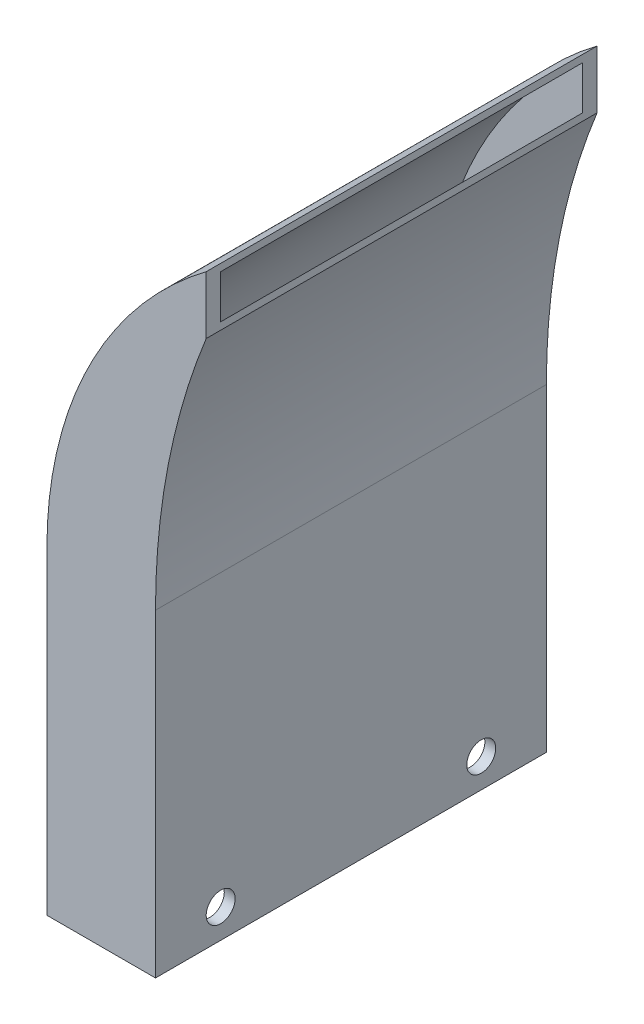
ISO-10303-21;
HEADER;
FILE_DESCRIPTION(('STEP AP214'),'2;1');
FILE_NAME('part.step','',(''),(''),'','','');
FILE_SCHEMA(('AUTOMOTIVE_DESIGN { 1 0 10303 214 1 1 1 1 }'));
ENDSEC;
DATA;
#1=APPLICATION_CONTEXT('core data for automotive mechanical design processes');
#2=APPLICATION_PROTOCOL_DEFINITION('international standard','automotive_design',2000,#1);
#3=PRODUCT_CONTEXT('',#1,'mechanical');
#4=PRODUCT('Part','Part','',(#3));
#5=PRODUCT_RELATED_PRODUCT_CATEGORY('part','',(#4));
#6=PRODUCT_DEFINITION_FORMATION('','',#4);
#7=PRODUCT_DEFINITION_CONTEXT('part definition',#1,'design');
#8=PRODUCT_DEFINITION('design','',#6,#7);
#9=PRODUCT_DEFINITION_SHAPE('','',#8);
#10=(LENGTH_UNIT() NAMED_UNIT(*) SI_UNIT(.MILLI.,.METRE.));
#11=(NAMED_UNIT(*) PLANE_ANGLE_UNIT() SI_UNIT($,.RADIAN.));
#12=(NAMED_UNIT(*) SI_UNIT($,.STERADIAN.) SOLID_ANGLE_UNIT());
#13=UNCERTAINTY_MEASURE_WITH_UNIT(LENGTH_MEASURE(1.E-05),#10,'distance_accuracy_value','');
#14=(GEOMETRIC_REPRESENTATION_CONTEXT(3) GLOBAL_UNCERTAINTY_ASSIGNED_CONTEXT((#13)) GLOBAL_UNIT_ASSIGNED_CONTEXT((#10,
#11,#12)) REPRESENTATION_CONTEXT('',''));
#15=CARTESIAN_POINT('',(0.,0.,0.));
#16=DIRECTION('',(0.,0.,1.));
#17=DIRECTION('',(1.,0.,0.));
#18=AXIS2_PLACEMENT_3D('',#15,#16,#17);
#19=CARTESIAN_POINT('',(-10.25,0.,27.));
#20=DIRECTION('',(-1.,0.,0.));
#21=DIRECTION('',(0.,0.,1.));
#22=AXIS2_PLACEMENT_3D('',#19,#20,#21);
#23=PLANE('',#22);
#24=CARTESIAN_POINT('',(-10.25,2.,4.5));
#25=DIRECTION('',(-1.,0.,0.));
#26=DIRECTION('',(0.,0.,1.));
#27=AXIS2_PLACEMENT_3D('',#24,#25,#26);
#28=CIRCLE('',#27,1.);
#29=CARTESIAN_POINT('',(-10.25,2.,5.5));
#30=VERTEX_POINT('',#29);
#31=EDGE_CURVE('E219',#30,#30,#28,.T.);
#32=ORIENTED_EDGE('',*,*,#31,.T.);
#33=EDGE_LOOP('',(#32));
#34=FACE_BOUND('',#33,.T.);
#35=CARTESIAN_POINT('',(-10.25,2.,22.5));
#36=DIRECTION('',(-1.,0.,0.));
#37=DIRECTION('',(0.,0.,1.));
#38=AXIS2_PLACEMENT_3D('',#35,#36,#37);
#39=CIRCLE('',#38,1.);
#40=CARTESIAN_POINT('',(-10.25,2.,23.5));
#41=VERTEX_POINT('',#40);
#42=EDGE_CURVE('E204',#41,#41,#39,.T.);
#43=ORIENTED_EDGE('',*,*,#42,.T.);
#44=EDGE_LOOP('',(#43));
#45=FACE_BOUND('',#44,.T.);
#46=DIRECTION('',(0.,1.,0.));
#47=VECTOR('',#46,1.);
#48=CARTESIAN_POINT('',(-10.25,0.,1.));
#49=LINE('',#48,#47);
#50=CARTESIAN_POINT('',(-10.25,0.,1.));
#51=VERTEX_POINT('',#50);
#52=CARTESIAN_POINT('',(-10.25,22.,1.));
#53=VERTEX_POINT('',#52);
#54=EDGE_CURVE('E55',#51,#53,#49,.T.);
#55=ORIENTED_EDGE('',*,*,#54,.T.);
#56=DIRECTION('',(0.,0.,-1.));
#57=VECTOR('',#56,1.);
#58=CARTESIAN_POINT('',(-10.25,22.,27.));
#59=LINE('',#58,#57);
#60=CARTESIAN_POINT('',(-10.25,22.,26.));
#61=VERTEX_POINT('',#60);
#62=EDGE_CURVE('E45',#61,#53,#59,.T.);
#63=ORIENTED_EDGE('',*,*,#62,.F.);
#64=DIRECTION('',(0.,-1.,0.));
#65=VECTOR('',#64,1.);
#66=CARTESIAN_POINT('',(-10.25,0.,26.));
#67=LINE('',#66,#65);
#68=CARTESIAN_POINT('',(-10.25,0.,26.));
#69=VERTEX_POINT('',#68);
#70=EDGE_CURVE('E170',#61,#69,#67,.T.);
#71=ORIENTED_EDGE('',*,*,#70,.T.);
#72=DIRECTION('',(0.,0.,-1.));
#73=VECTOR('',#72,1.);
#74=CARTESIAN_POINT('',(-10.25,0.,27.));
#75=LINE('',#74,#73);
#76=EDGE_CURVE('E11',#69,#51,#75,.T.);
#77=ORIENTED_EDGE('',*,*,#76,.T.);
#78=EDGE_LOOP('',(#55,#63,#71,#77));
#79=FACE_BOUND('',#78,.T.);
#80=ADVANCED_FACE('F36',(#34,#45,#79),#23,.F.);
#81=CARTESIAN_POINT('',(17.4237804878049,22.,27.));
#82=DIRECTION('',(0.,0.,-1.));
#83=DIRECTION('',(-1.,0.,0.));
#84=AXIS2_PLACEMENT_3D('',#81,#82,#83);
#85=CYLINDRICAL_SURFACE('',#84,27.6737804878049);
#86=CARTESIAN_POINT('',(17.4237804878049,22.,1.));
#87=DIRECTION('',(0.,0.,-1.));
#88=DIRECTION('',(-1.,0.,0.));
#89=AXIS2_PLACEMENT_3D('',#86,#87,#88);
#90=CIRCLE('',#89,27.6737804878049);
#91=CARTESIAN_POINT('',(0.,43.5,1.));
#92=VERTEX_POINT('',#91);
#93=EDGE_CURVE('E228',#53,#92,#90,.T.);
#94=ORIENTED_EDGE('',*,*,#93,.T.);
#95=DIRECTION('',(0.,0.,-1.));
#96=VECTOR('',#95,1.);
#97=CARTESIAN_POINT('',(0.,43.5,27.));
#98=LINE('',#97,#96);
#99=CARTESIAN_POINT('',(0.,43.5,26.));
#100=VERTEX_POINT('',#99);
#101=EDGE_CURVE('E194',#100,#92,#98,.T.);
#102=ORIENTED_EDGE('',*,*,#101,.F.);
#103=CARTESIAN_POINT('',(17.4237804878049,22.,26.));
#104=DIRECTION('',(0.,0.,1.));
#105=DIRECTION('',(-1.,0.,0.));
#106=AXIS2_PLACEMENT_3D('',#103,#104,#105);
#107=CIRCLE('',#106,27.6737804878049);
#108=EDGE_CURVE('E167',#100,#61,#107,.T.);
#109=ORIENTED_EDGE('',*,*,#108,.T.);
#110=ORIENTED_EDGE('',*,*,#62,.T.);
#111=EDGE_LOOP('',(#94,#102,#109,#110));
#112=FACE_BOUND('',#111,.T.);
#113=ADVANCED_FACE('F262',(#112),#85,.F.);
#114=CARTESIAN_POINT('',(38.1397058823529,22.,27.));
#115=DIRECTION('',(0.,0.,-1.));
#116=DIRECTION('',(-1.,0.,0.));
#117=AXIS2_PLACEMENT_3D('',#114,#115,#116);
#118=CYLINDRICAL_SURFACE('',#117,42.3897058823529);
#119=CARTESIAN_POINT('',(38.1397058823529,22.,1.));
#120=DIRECTION('',(0.,0.,1.));
#121=DIRECTION('',(-1.,0.,0.));
#122=AXIS2_PLACEMENT_3D('',#119,#120,#121);
#123=CIRCLE('',#122,42.3897058823529);
#124=CARTESIAN_POINT('',(0.,40.5,1.));
#125=VERTEX_POINT('',#124);
#126=CARTESIAN_POINT('',(-4.25,22.,1.));
#127=VERTEX_POINT('',#126);
#128=EDGE_CURVE('E233',#125,#127,#123,.T.);
#129=ORIENTED_EDGE('',*,*,#128,.T.);
#130=DIRECTION('',(0.,0.,-1.));
#131=VECTOR('',#130,1.);
#132=CARTESIAN_POINT('',(-4.25,22.,27.));
#133=LINE('',#132,#131);
#134=CARTESIAN_POINT('',(-4.25,22.,26.));
#135=VERTEX_POINT('',#134);
#136=EDGE_CURVE('E158',#135,#127,#133,.T.);
#137=ORIENTED_EDGE('',*,*,#136,.F.);
#138=CARTESIAN_POINT('',(38.1397058823529,22.,26.));
#139=DIRECTION('',(0.,0.,-1.));
#140=DIRECTION('',(-1.,0.,0.));
#141=AXIS2_PLACEMENT_3D('',#138,#139,#140);
#142=CIRCLE('',#141,42.3897058823529);
#143=CARTESIAN_POINT('',(0.,40.5,26.));
#144=VERTEX_POINT('',#143);
#145=EDGE_CURVE('E156',#135,#144,#142,.T.);
#146=ORIENTED_EDGE('',*,*,#145,.T.);
#147=DIRECTION('',(0.,0.,-1.));
#148=VECTOR('',#147,1.);
#149=CARTESIAN_POINT('',(0.,40.5,27.));
#150=LINE('',#149,#148);
#151=EDGE_CURVE('E153',#144,#125,#150,.T.);
#152=ORIENTED_EDGE('',*,*,#151,.T.);
#153=EDGE_LOOP('',(#129,#137,#146,#152));
#154=FACE_BOUND('',#153,.T.);
#155=ADVANCED_FACE('F265',(#154),#118,.T.);
#156=CARTESIAN_POINT('',(-4.25,0.,27.));
#157=DIRECTION('',(1.,0.,0.));
#158=DIRECTION('',(0.,0.,-1.));
#159=AXIS2_PLACEMENT_3D('',#156,#157,#158);
#160=PLANE('',#159);
#161=CARTESIAN_POINT('',(-4.25,2.,4.5));
#162=DIRECTION('',(1.,0.,0.));
#163=DIRECTION('',(0.,0.,-1.));
#164=AXIS2_PLACEMENT_3D('',#161,#162,#163);
#165=CIRCLE('',#164,1.);
#166=CARTESIAN_POINT('',(-4.25,2.,3.5));
#167=VERTEX_POINT('',#166);
#168=EDGE_CURVE('E216',#167,#167,#165,.T.);
#169=ORIENTED_EDGE('',*,*,#168,.T.);
#170=EDGE_LOOP('',(#169));
#171=FACE_BOUND('',#170,.T.);
#172=CARTESIAN_POINT('',(-4.25,2.,22.5));
#173=DIRECTION('',(1.,0.,0.));
#174=DIRECTION('',(0.,0.,-1.));
#175=AXIS2_PLACEMENT_3D('',#172,#173,#174);
#176=CIRCLE('',#175,1.);
#177=CARTESIAN_POINT('',(-4.25,2.,21.5));
#178=VERTEX_POINT('',#177);
#179=EDGE_CURVE('E199',#178,#178,#176,.T.);
#180=ORIENTED_EDGE('',*,*,#179,.T.);
#181=EDGE_LOOP('',(#180));
#182=FACE_BOUND('',#181,.T.);
#183=DIRECTION('',(0.,-1.,0.));
#184=VECTOR('',#183,1.);
#185=CARTESIAN_POINT('',(-4.25,0.,1.));
#186=LINE('',#185,#184);
#187=CARTESIAN_POINT('',(-4.25,0.,1.));
#188=VERTEX_POINT('',#187);
#189=EDGE_CURVE('E222',#127,#188,#186,.T.);
#190=ORIENTED_EDGE('',*,*,#189,.T.);
#191=DIRECTION('',(0.,0.,-1.));
#192=VECTOR('',#191,1.);
#193=CARTESIAN_POINT('',(-4.25,0.,27.));
#194=LINE('',#193,#192);
#195=CARTESIAN_POINT('',(-4.25,0.,26.));
#196=VERTEX_POINT('',#195);
#197=EDGE_CURVE('E243',#196,#188,#194,.T.);
#198=ORIENTED_EDGE('',*,*,#197,.F.);
#199=DIRECTION('',(0.,1.,0.));
#200=VECTOR('',#199,1.);
#201=CARTESIAN_POINT('',(-4.25,0.,26.));
#202=LINE('',#201,#200);
#203=EDGE_CURVE('E152',#196,#135,#202,.T.);
#204=ORIENTED_EDGE('',*,*,#203,.T.);
#205=ORIENTED_EDGE('',*,*,#136,.T.);
#206=EDGE_LOOP('',(#190,#198,#204,#205));
#207=FACE_BOUND('',#206,.T.);
#208=ADVANCED_FACE('F249',(#171,#182,#207),#160,.F.);
#209=CARTESIAN_POINT('',(-11.,0.,27.));
#210=DIRECTION('',(0.,1.,0.));
#211=DIRECTION('',(-1.,0.,0.));
#212=AXIS2_PLACEMENT_3D('',#209,#210,#211);
#213=PLANE('',#212);
#214=DIRECTION('',(1.,0.,0.));
#215=VECTOR('',#214,1.);
#216=CARTESIAN_POINT('',(-11.,0.,0.));
#217=LINE('',#216,#215);
#218=CARTESIAN_POINT('',(-11.,0.,0.));
#219=VERTEX_POINT('',#218);
#220=CARTESIAN_POINT('',(-3.5,0.,0.));
#221=VERTEX_POINT('',#220);
#222=EDGE_CURVE('E175',#219,#221,#217,.T.);
#223=ORIENTED_EDGE('',*,*,#222,.T.);
#224=DIRECTION('',(0.,0.,-1.));
#225=VECTOR('',#224,1.);
#226=CARTESIAN_POINT('',(-3.5,0.,27.));
#227=LINE('',#226,#225);
#228=CARTESIAN_POINT('',(-3.5,0.,27.));
#229=VERTEX_POINT('',#228);
#230=EDGE_CURVE('E240',#229,#221,#227,.T.);
#231=ORIENTED_EDGE('',*,*,#230,.F.);
#232=DIRECTION('',(1.,0.,0.));
#233=VECTOR('',#232,1.);
#234=CARTESIAN_POINT('',(-11.,0.,27.));
#235=LINE('',#234,#233);
#236=CARTESIAN_POINT('',(-11.,0.,27.));
#237=VERTEX_POINT('',#236);
#238=EDGE_CURVE('E137',#237,#229,#235,.T.);
#239=ORIENTED_EDGE('',*,*,#238,.F.);
#240=DIRECTION('',(0.,0.,-1.));
#241=VECTOR('',#240,1.);
#242=CARTESIAN_POINT('',(-11.,0.,27.));
#243=LINE('',#242,#241);
#244=EDGE_CURVE('E181',#237,#219,#243,.T.);
#245=ORIENTED_EDGE('',*,*,#244,.T.);
#246=EDGE_LOOP('',(#223,#231,#239,#245));
#247=FACE_BOUND('',#246,.T.);
#248=DIRECTION('',(-1.,0.,0.));
#249=VECTOR('',#248,1.);
#250=CARTESIAN_POINT('',(-4.25,0.,1.));
#251=LINE('',#250,#249);
#252=EDGE_CURVE('E224',#188,#51,#251,.T.);
#253=ORIENTED_EDGE('',*,*,#252,.T.);
#254=ORIENTED_EDGE('',*,*,#76,.F.);
#255=DIRECTION('',(1.,0.,0.));
#256=VECTOR('',#255,1.);
#257=CARTESIAN_POINT('',(-4.25,0.,26.));
#258=LINE('',#257,#256);
#259=EDGE_CURVE('E172',#69,#196,#258,.T.);
#260=ORIENTED_EDGE('',*,*,#259,.T.);
#261=ORIENTED_EDGE('',*,*,#197,.T.);
#262=EDGE_LOOP('',(#253,#254,#260,#261));
#263=FACE_BOUND('',#262,.T.);
#264=ADVANCED_FACE('F38',(#247,#263),#213,.F.);
#265=CARTESIAN_POINT('',(0.,44.,27.));
#266=DIRECTION('',(-1.,0.,0.));
#267=DIRECTION('',(0.,-1.,0.));
#268=AXIS2_PLACEMENT_3D('',#265,#266,#267);
#269=PLANE('',#268);
#270=DIRECTION('',(0.,0.,-1.));
#271=VECTOR('',#270,1.);
#272=CARTESIAN_POINT('',(0.,40.,27.));
#273=LINE('',#272,#271);
#274=CARTESIAN_POINT('',(0.,40.,27.));
#275=VERTEX_POINT('',#274);
#276=CARTESIAN_POINT('',(0.,40.,0.));
#277=VERTEX_POINT('',#276);
#278=EDGE_CURVE('E130',#275,#277,#273,.T.);
#279=ORIENTED_EDGE('',*,*,#278,.T.);
#280=DIRECTION('',(0.,1.,0.));
#281=VECTOR('',#280,1.);
#282=CARTESIAN_POINT('',(0.,44.,0.));
#283=LINE('',#282,#281);
#284=CARTESIAN_POINT('',(0.,44.,0.));
#285=VERTEX_POINT('',#284);
#286=EDGE_CURVE('E183',#277,#285,#283,.T.);
#287=ORIENTED_EDGE('',*,*,#286,.T.);
#288=DIRECTION('',(0.,0.,-1.));
#289=VECTOR('',#288,1.);
#290=CARTESIAN_POINT('',(0.,44.,27.));
#291=LINE('',#290,#289);
#292=CARTESIAN_POINT('',(0.,44.,27.));
#293=VERTEX_POINT('',#292);
#294=EDGE_CURVE('E133',#293,#285,#291,.T.);
#295=ORIENTED_EDGE('',*,*,#294,.F.);
#296=DIRECTION('',(0.,1.,0.));
#297=VECTOR('',#296,1.);
#298=CARTESIAN_POINT('',(0.,44.,27.));
#299=LINE('',#298,#297);
#300=EDGE_CURVE('E125',#275,#293,#299,.T.);
#301=ORIENTED_EDGE('',*,*,#300,.F.);
#302=EDGE_LOOP('',(#279,#287,#295,#301));
#303=FACE_BOUND('',#302,.T.);
#304=ORIENTED_EDGE('',*,*,#101,.T.);
#305=DIRECTION('',(0.,-1.,0.));
#306=VECTOR('',#305,1.);
#307=CARTESIAN_POINT('',(0.,43.5,1.));
#308=LINE('',#307,#306);
#309=EDGE_CURVE('E230',#92,#125,#308,.T.);
#310=ORIENTED_EDGE('',*,*,#309,.T.);
#311=ORIENTED_EDGE('',*,*,#151,.F.);
#312=DIRECTION('',(0.,1.,0.));
#313=VECTOR('',#312,1.);
#314=CARTESIAN_POINT('',(0.,43.5,26.));
#315=LINE('',#314,#313);
#316=EDGE_CURVE('E164',#144,#100,#315,.T.);
#317=ORIENTED_EDGE('',*,*,#316,.T.);
#318=EDGE_LOOP('',(#304,#310,#311,#317));
#319=FACE_BOUND('',#318,.T.);
#320=ADVANCED_FACE('F127',(#303,#319),#269,.F.);
#321=CARTESIAN_POINT('',(16.5,22.,27.));
#322=DIRECTION('',(0.,0.,-1.));
#323=DIRECTION('',(-1.,0.,0.));
#324=AXIS2_PLACEMENT_3D('',#321,#322,#323);
#325=CYLINDRICAL_SURFACE('',#324,27.5);
#326=CARTESIAN_POINT('',(16.5,22.,0.));
#327=DIRECTION('',(0.,0.,1.));
#328=DIRECTION('',(-1.,0.,0.));
#329=AXIS2_PLACEMENT_3D('',#326,#327,#328);
#330=CIRCLE('',#329,27.5);
#331=CARTESIAN_POINT('',(-11.,22.,0.));
#332=VERTEX_POINT('',#331);
#333=EDGE_CURVE('E185',#285,#332,#330,.T.);
#334=ORIENTED_EDGE('',*,*,#333,.T.);
#335=DIRECTION('',(0.,0.,-1.));
#336=VECTOR('',#335,1.);
#337=CARTESIAN_POINT('',(-11.,22.,27.));
#338=LINE('',#337,#336);
#339=CARTESIAN_POINT('',(-11.,22.,27.));
#340=VERTEX_POINT('',#339);
#341=EDGE_CURVE('E190',#340,#332,#338,.T.);
#342=ORIENTED_EDGE('',*,*,#341,.F.);
#343=CARTESIAN_POINT('',(16.5,22.,27.));
#344=DIRECTION('',(0.,0.,1.));
#345=DIRECTION('',(-1.,0.,0.));
#346=AXIS2_PLACEMENT_3D('',#343,#344,#345);
#347=CIRCLE('',#346,27.5);
#348=EDGE_CURVE('E136',#293,#340,#347,.T.);
#349=ORIENTED_EDGE('',*,*,#348,.F.);
#350=ORIENTED_EDGE('',*,*,#294,.T.);
#351=EDGE_LOOP('',(#334,#342,#349,#350));
#352=FACE_BOUND('',#351,.T.);
#353=ADVANCED_FACE('F284',(#352),#325,.T.);
#354=CARTESIAN_POINT('',(-11.,0.,27.));
#355=DIRECTION('',(1.,0.,0.));
#356=DIRECTION('',(0.,0.,-1.));
#357=AXIS2_PLACEMENT_3D('',#354,#355,#356);
#358=PLANE('',#357);
#359=CARTESIAN_POINT('',(-11.,2.,4.5));
#360=DIRECTION('',(-1.,0.,0.));
#361=DIRECTION('',(0.,0.,1.));
#362=AXIS2_PLACEMENT_3D('',#359,#360,#361);
#363=CIRCLE('',#362,1.);
#364=CARTESIAN_POINT('',(-11.,2.,5.5));
#365=VERTEX_POINT('',#364);
#366=EDGE_CURVE('E200',#365,#365,#363,.T.);
#367=ORIENTED_EDGE('',*,*,#366,.F.);
#368=EDGE_LOOP('',(#367));
#369=FACE_BOUND('',#368,.T.);
#370=CARTESIAN_POINT('',(-11.,2.,22.5));
#371=DIRECTION('',(-1.,0.,0.));
#372=DIRECTION('',(0.,0.,1.));
#373=AXIS2_PLACEMENT_3D('',#370,#371,#372);
#374=CIRCLE('',#373,1.);
#375=CARTESIAN_POINT('',(-11.,2.,23.5));
#376=VERTEX_POINT('',#375);
#377=EDGE_CURVE('E207',#376,#376,#374,.T.);
#378=ORIENTED_EDGE('',*,*,#377,.F.);
#379=EDGE_LOOP('',(#378));
#380=FACE_BOUND('',#379,.T.);
#381=DIRECTION('',(0.,-1.,0.));
#382=VECTOR('',#381,1.);
#383=CARTESIAN_POINT('',(-11.,0.,0.));
#384=LINE('',#383,#382);
#385=EDGE_CURVE('E176',#332,#219,#384,.T.);
#386=ORIENTED_EDGE('',*,*,#385,.T.);
#387=ORIENTED_EDGE('',*,*,#244,.F.);
#388=DIRECTION('',(0.,-1.,0.));
#389=VECTOR('',#388,1.);
#390=CARTESIAN_POINT('',(-11.,0.,27.));
#391=LINE('',#390,#389);
#392=EDGE_CURVE('E179',#340,#237,#391,.T.);
#393=ORIENTED_EDGE('',*,*,#392,.F.);
#394=ORIENTED_EDGE('',*,*,#341,.T.);
#395=EDGE_LOOP('',(#386,#387,#393,#394));
#396=FACE_BOUND('',#395,.T.);
#397=ADVANCED_FACE('F287',(#369,#380,#396),#358,.F.);
#398=CARTESIAN_POINT('',(17.4237804878049,22.,27.));
#399=DIRECTION('',(0.,0.,-1.));
#400=DIRECTION('',(-1.,0.,0.));
#401=AXIS2_PLACEMENT_3D('',#398,#399,#400);
#402=PLANE('',#401);
#403=ORIENTED_EDGE('',*,*,#238,.T.);
#404=DIRECTION('',(0.,1.,0.));
#405=VECTOR('',#404,1.);
#406=CARTESIAN_POINT('',(-3.5,0.,27.));
#407=LINE('',#406,#405);
#408=CARTESIAN_POINT('',(-3.5,22.,27.));
#409=VERTEX_POINT('',#408);
#410=EDGE_CURVE('E143',#229,#409,#407,.T.);
#411=ORIENTED_EDGE('',*,*,#410,.T.);
#412=CARTESIAN_POINT('',(44.5357142857143,22.,27.));
#413=DIRECTION('',(0.,0.,-1.));
#414=DIRECTION('',(-1.,0.,0.));
#415=AXIS2_PLACEMENT_3D('',#412,#413,#414);
#416=CIRCLE('',#415,48.0357142857143);
#417=EDGE_CURVE('E140',#409,#275,#416,.T.);
#418=ORIENTED_EDGE('',*,*,#417,.T.);
#419=ORIENTED_EDGE('',*,*,#300,.T.);
#420=ORIENTED_EDGE('',*,*,#348,.T.);
#421=ORIENTED_EDGE('',*,*,#392,.T.);
#422=EDGE_LOOP('',(#403,#411,#418,#419,#420,#421));
#423=FACE_BOUND('',#422,.T.);
#424=ADVANCED_FACE('F141',(#423),#402,.F.);
#425=CARTESIAN_POINT('',(17.4237804878049,22.,0.));
#426=DIRECTION('',(0.,0.,-1.));
#427=DIRECTION('',(-1.,0.,0.));
#428=AXIS2_PLACEMENT_3D('',#425,#426,#427);
#429=PLANE('',#428);
#430=ORIENTED_EDGE('',*,*,#286,.F.);
#431=CARTESIAN_POINT('',(44.5357142857143,22.,0.));
#432=DIRECTION('',(0.,0.,-1.));
#433=DIRECTION('',(-1.,0.,0.));
#434=AXIS2_PLACEMENT_3D('',#431,#432,#433);
#435=CIRCLE('',#434,48.0357142857143);
#436=CARTESIAN_POINT('',(-3.5,22.,0.));
#437=VERTEX_POINT('',#436);
#438=EDGE_CURVE('E151',#437,#277,#435,.T.);
#439=ORIENTED_EDGE('',*,*,#438,.F.);
#440=DIRECTION('',(0.,1.,0.));
#441=VECTOR('',#440,1.);
#442=CARTESIAN_POINT('',(-3.5,0.,0.));
#443=LINE('',#442,#441);
#444=EDGE_CURVE('E147',#221,#437,#443,.T.);
#445=ORIENTED_EDGE('',*,*,#444,.F.);
#446=ORIENTED_EDGE('',*,*,#222,.F.);
#447=ORIENTED_EDGE('',*,*,#385,.F.);
#448=ORIENTED_EDGE('',*,*,#333,.F.);
#449=EDGE_LOOP('',(#430,#439,#445,#446,#447,#448));
#450=FACE_BOUND('',#449,.T.);
#451=ADVANCED_FACE('F292',(#450),#429,.T.);
#452=CARTESIAN_POINT('',(38.1397058823529,22.,26.));
#453=DIRECTION('',(0.,0.,-1.));
#454=DIRECTION('',(-1.,0.,0.));
#455=AXIS2_PLACEMENT_3D('',#452,#453,#454);
#456=PLANE('',#455);
#457=ORIENTED_EDGE('',*,*,#203,.F.);
#458=ORIENTED_EDGE('',*,*,#259,.F.);
#459=ORIENTED_EDGE('',*,*,#70,.F.);
#460=ORIENTED_EDGE('',*,*,#108,.F.);
#461=ORIENTED_EDGE('',*,*,#316,.F.);
#462=ORIENTED_EDGE('',*,*,#145,.F.);
#463=EDGE_LOOP('',(#457,#458,#459,#460,#461,#462));
#464=FACE_BOUND('',#463,.T.);
#465=ADVANCED_FACE('F260',(#464),#456,.T.);
#466=CARTESIAN_POINT('',(44.5357142857143,22.,27.));
#467=DIRECTION('',(0.,0.,-1.));
#468=DIRECTION('',(-1.,0.,0.));
#469=AXIS2_PLACEMENT_3D('',#466,#467,#468);
#470=CYLINDRICAL_SURFACE('',#469,48.0357142857143);
#471=ORIENTED_EDGE('',*,*,#438,.T.);
#472=ORIENTED_EDGE('',*,*,#278,.F.);
#473=ORIENTED_EDGE('',*,*,#417,.F.);
#474=DIRECTION('',(0.,0.,-1.));
#475=VECTOR('',#474,1.);
#476=CARTESIAN_POINT('',(-3.5,22.,27.));
#477=LINE('',#476,#475);
#478=EDGE_CURVE('E236',#409,#437,#477,.T.);
#479=ORIENTED_EDGE('',*,*,#478,.T.);
#480=EDGE_LOOP('',(#471,#472,#473,#479));
#481=FACE_BOUND('',#480,.T.);
#482=ADVANCED_FACE('F149',(#481),#470,.F.);
#483=CARTESIAN_POINT('',(-3.5,0.,27.));
#484=DIRECTION('',(-1.,0.,0.));
#485=DIRECTION('',(0.,0.,1.));
#486=AXIS2_PLACEMENT_3D('',#483,#484,#485);
#487=PLANE('',#486);
#488=CARTESIAN_POINT('',(-3.5,2.,4.5));
#489=DIRECTION('',(-1.,0.,0.));
#490=DIRECTION('',(0.,0.,1.));
#491=AXIS2_PLACEMENT_3D('',#488,#489,#490);
#492=CIRCLE('',#491,1.);
#493=CARTESIAN_POINT('',(-3.5,2.,5.5));
#494=VERTEX_POINT('',#493);
#495=EDGE_CURVE('E40',#494,#494,#492,.T.);
#496=ORIENTED_EDGE('',*,*,#495,.T.);
#497=EDGE_LOOP('',(#496));
#498=FACE_BOUND('',#497,.T.);
#499=CARTESIAN_POINT('',(-3.5,2.,22.5));
#500=DIRECTION('',(-1.,0.,0.));
#501=DIRECTION('',(0.,0.,1.));
#502=AXIS2_PLACEMENT_3D('',#499,#500,#501);
#503=CIRCLE('',#502,1.);
#504=CARTESIAN_POINT('',(-3.5,2.,23.5));
#505=VERTEX_POINT('',#504);
#506=EDGE_CURVE('E197',#505,#505,#503,.T.);
#507=ORIENTED_EDGE('',*,*,#506,.T.);
#508=EDGE_LOOP('',(#507));
#509=FACE_BOUND('',#508,.T.);
#510=ORIENTED_EDGE('',*,*,#444,.T.);
#511=ORIENTED_EDGE('',*,*,#478,.F.);
#512=ORIENTED_EDGE('',*,*,#410,.F.);
#513=ORIENTED_EDGE('',*,*,#230,.T.);
#514=EDGE_LOOP('',(#510,#511,#512,#513));
#515=FACE_BOUND('',#514,.T.);
#516=ADVANCED_FACE('F300',(#498,#509,#515),#487,.F.);
#517=CARTESIAN_POINT('',(38.1397058823529,22.,1.));
#518=DIRECTION('',(0.,0.,-1.));
#519=DIRECTION('',(-1.,0.,0.));
#520=AXIS2_PLACEMENT_3D('',#517,#518,#519);
#521=PLANE('',#520);
#522=ORIENTED_EDGE('',*,*,#189,.F.);
#523=ORIENTED_EDGE('',*,*,#128,.F.);
#524=ORIENTED_EDGE('',*,*,#309,.F.);
#525=ORIENTED_EDGE('',*,*,#93,.F.);
#526=ORIENTED_EDGE('',*,*,#54,.F.);
#527=ORIENTED_EDGE('',*,*,#252,.F.);
#528=EDGE_LOOP('',(#522,#523,#524,#525,#526,#527));
#529=FACE_BOUND('',#528,.T.);
#530=ADVANCED_FACE('F255',(#529),#521,.F.);
#531=CARTESIAN_POINT('',(4.,2.,22.5));
#532=DIRECTION('',(-1.,0.,0.));
#533=DIRECTION('',(0.,0.,1.));
#534=AXIS2_PLACEMENT_3D('',#531,#532,#533);
#535=CYLINDRICAL_SURFACE('',#534,1.);
#536=ORIENTED_EDGE('',*,*,#506,.F.);
#537=EDGE_LOOP('',(#536));
#538=FACE_BOUND('',#537,.T.);
#539=ORIENTED_EDGE('',*,*,#179,.F.);
#540=EDGE_LOOP('',(#539));
#541=FACE_BOUND('',#540,.T.);
#542=ADVANCED_FACE('F309',(#538,#541),#535,.F.);
#543=CARTESIAN_POINT('',(4.,2.,4.5));
#544=DIRECTION('',(-1.,0.,0.));
#545=DIRECTION('',(0.,0.,1.));
#546=AXIS2_PLACEMENT_3D('',#543,#544,#545);
#547=CYLINDRICAL_SURFACE('',#546,1.);
#548=ORIENTED_EDGE('',*,*,#495,.F.);
#549=EDGE_LOOP('',(#548));
#550=FACE_BOUND('',#549,.T.);
#551=ORIENTED_EDGE('',*,*,#168,.F.);
#552=EDGE_LOOP('',(#551));
#553=FACE_BOUND('',#552,.T.);
#554=ADVANCED_FACE('F317',(#550,#553),#547,.F.);
#555=ORIENTED_EDGE('',*,*,#377,.T.);
#556=EDGE_LOOP('',(#555));
#557=FACE_BOUND('',#556,.T.);
#558=ORIENTED_EDGE('',*,*,#42,.F.);
#559=EDGE_LOOP('',(#558));
#560=FACE_BOUND('',#559,.T.);
#561=ADVANCED_FACE('F313',(#557,#560),#535,.F.);
#562=ORIENTED_EDGE('',*,*,#366,.T.);
#563=EDGE_LOOP('',(#562));
#564=FACE_BOUND('',#563,.T.);
#565=ORIENTED_EDGE('',*,*,#31,.F.);
#566=EDGE_LOOP('',(#565));
#567=FACE_BOUND('',#566,.T.);
#568=ADVANCED_FACE('F316',(#564,#567),#547,.F.);
#569=CLOSED_SHELL('',(#80,#113,#155,#208,#264,#320,#353,#397,#424,#451,#465,#482,#516,#530,#542,
#554,#561,#568));
#570=MANIFOLD_SOLID_BREP('B2',#569);
#571=ADVANCED_BREP_SHAPE_REPRESENTATION('',(#18,#570),#14);
#572=SHAPE_DEFINITION_REPRESENTATION(#9,#571);
ENDSEC;
END-ISO-10303-21;
